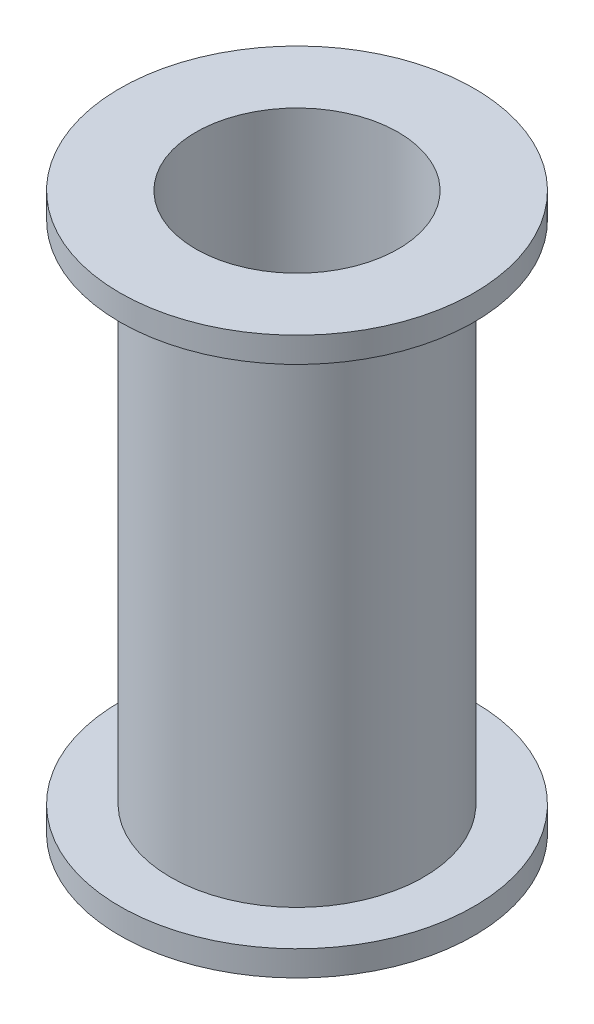
ISO-10303-21;
HEADER;
FILE_DESCRIPTION(('STEP AP214'),'2;1');
FILE_NAME('part.step','',(''),(''),'','','');
FILE_SCHEMA(('AUTOMOTIVE_DESIGN { 1 0 10303 214 1 1 1 1 }'));
ENDSEC;
DATA;
#1=APPLICATION_CONTEXT('core data for automotive mechanical design processes');
#2=APPLICATION_PROTOCOL_DEFINITION('international standard','automotive_design',2000,#1);
#3=PRODUCT_CONTEXT('',#1,'mechanical');
#4=PRODUCT('Part','Part','',(#3));
#5=PRODUCT_RELATED_PRODUCT_CATEGORY('part','',(#4));
#6=PRODUCT_DEFINITION_FORMATION('','',#4);
#7=PRODUCT_DEFINITION_CONTEXT('part definition',#1,'design');
#8=PRODUCT_DEFINITION('design','',#6,#7);
#9=PRODUCT_DEFINITION_SHAPE('','',#8);
#10=(LENGTH_UNIT() NAMED_UNIT(*) SI_UNIT(.MILLI.,.METRE.));
#11=(NAMED_UNIT(*) PLANE_ANGLE_UNIT() SI_UNIT($,.RADIAN.));
#12=(NAMED_UNIT(*) SI_UNIT($,.STERADIAN.) SOLID_ANGLE_UNIT());
#13=UNCERTAINTY_MEASURE_WITH_UNIT(LENGTH_MEASURE(1.E-05),#10,'distance_accuracy_value','');
#14=(GEOMETRIC_REPRESENTATION_CONTEXT(3) GLOBAL_UNCERTAINTY_ASSIGNED_CONTEXT((#13)) GLOBAL_UNIT_ASSIGNED_CONTEXT((#10,
#11,#12)) REPRESENTATION_CONTEXT('',''));
#15=CARTESIAN_POINT('',(0.,0.,0.));
#16=DIRECTION('',(0.,0.,1.));
#17=DIRECTION('',(1.,0.,0.));
#18=AXIS2_PLACEMENT_3D('',#15,#16,#17);
#19=CARTESIAN_POINT('',(0.,200.,0.));
#20=DIRECTION('',(0.,-1.,0.));
#21=DIRECTION('',(0.,0.,-1.));
#22=AXIS2_PLACEMENT_3D('',#19,#20,#21);
#23=CYLINDRICAL_SURFACE('',#22,50.);
#24=CARTESIAN_POINT('',(0.,200.,0.));
#25=DIRECTION('',(0.,1.,0.));
#26=DIRECTION('',(0.,0.,1.));
#27=AXIS2_PLACEMENT_3D('',#24,#25,#26);
#28=CIRCLE('',#27,50.);
#29=CARTESIAN_POINT('',(0.,200.,50.));
#30=VERTEX_POINT('',#29);
#31=EDGE_CURVE('E10',#30,#30,#28,.T.);
#32=ORIENTED_EDGE('',*,*,#31,.F.);
#33=EDGE_LOOP('',(#32));
#34=FACE_BOUND('',#33,.T.);
#35=CARTESIAN_POINT('',(0.,0.,0.));
#36=DIRECTION('',(0.,1.,0.));
#37=DIRECTION('',(0.,0.,1.));
#38=AXIS2_PLACEMENT_3D('',#35,#36,#37);
#39=CIRCLE('',#38,50.);
#40=CARTESIAN_POINT('',(0.,0.,50.));
#41=VERTEX_POINT('',#40);
#42=EDGE_CURVE('E40',#41,#41,#39,.T.);
#43=ORIENTED_EDGE('',*,*,#42,.T.);
#44=EDGE_LOOP('',(#43));
#45=FACE_BOUND('',#44,.T.);
#46=ADVANCED_FACE('F37',(#34,#45),#23,.T.);
#47=CARTESIAN_POINT('',(0.,210.,0.));
#48=DIRECTION('',(0.,-1.,0.));
#49=DIRECTION('',(0.,0.,-1.));
#50=AXIS2_PLACEMENT_3D('',#47,#48,#49);
#51=CYLINDRICAL_SURFACE('',#50,70.);
#52=CARTESIAN_POINT('',(0.,210.,0.));
#53=DIRECTION('',(0.,1.,0.));
#54=DIRECTION('',(0.,0.,1.));
#55=AXIS2_PLACEMENT_3D('',#52,#53,#54);
#56=CIRCLE('',#55,70.);
#57=CARTESIAN_POINT('',(0.,210.,70.));
#58=VERTEX_POINT('',#57);
#59=EDGE_CURVE('E45',#58,#58,#56,.T.);
#60=ORIENTED_EDGE('',*,*,#59,.F.);
#61=EDGE_LOOP('',(#60));
#62=FACE_BOUND('',#61,.T.);
#63=CARTESIAN_POINT('',(0.,200.,0.));
#64=DIRECTION('',(0.,1.,0.));
#65=DIRECTION('',(0.,0.,1.));
#66=AXIS2_PLACEMENT_3D('',#63,#64,#65);
#67=CIRCLE('',#66,70.);
#68=CARTESIAN_POINT('',(0.,200.,70.));
#69=VERTEX_POINT('',#68);
#70=EDGE_CURVE('E50',#69,#69,#67,.T.);
#71=ORIENTED_EDGE('',*,*,#70,.T.);
#72=EDGE_LOOP('',(#71));
#73=FACE_BOUND('',#72,.T.);
#74=ADVANCED_FACE('F103',(#62,#73),#51,.T.);
#75=CARTESIAN_POINT('',(0.,210.,0.));
#76=DIRECTION('',(0.,1.,0.));
#77=DIRECTION('',(0.,0.,1.));
#78=AXIS2_PLACEMENT_3D('',#75,#76,#77);
#79=PLANE('',#78);
#80=CARTESIAN_POINT('',(0.,210.,0.));
#81=DIRECTION('',(0.,-1.,0.));
#82=DIRECTION('',(0.,0.,-1.));
#83=AXIS2_PLACEMENT_3D('',#80,#81,#82);
#84=CIRCLE('',#83,40.);
#85=CARTESIAN_POINT('',(0.,210.,-40.));
#86=VERTEX_POINT('',#85);
#87=EDGE_CURVE('E61',#86,#86,#84,.T.);
#88=ORIENTED_EDGE('',*,*,#87,.T.);
#89=EDGE_LOOP('',(#88));
#90=FACE_BOUND('',#89,.T.);
#91=ORIENTED_EDGE('',*,*,#59,.T.);
#92=EDGE_LOOP('',(#91));
#93=FACE_BOUND('',#92,.T.);
#94=ADVANCED_FACE('F73',(#90,#93),#79,.T.);
#95=CARTESIAN_POINT('',(0.,200.,0.));
#96=DIRECTION('',(0.,1.,0.));
#97=DIRECTION('',(0.,0.,1.));
#98=AXIS2_PLACEMENT_3D('',#95,#96,#97);
#99=PLANE('',#98);
#100=ORIENTED_EDGE('',*,*,#31,.T.);
#101=EDGE_LOOP('',(#100));
#102=FACE_BOUND('',#101,.T.);
#103=ORIENTED_EDGE('',*,*,#70,.F.);
#104=EDGE_LOOP('',(#103));
#105=FACE_BOUND('',#104,.T.);
#106=ADVANCED_FACE('F92',(#102,#105),#99,.F.);
#107=CARTESIAN_POINT('',(0.,-10.,0.));
#108=DIRECTION('',(0.,1.,0.));
#109=DIRECTION('',(0.,0.,1.));
#110=AXIS2_PLACEMENT_3D('',#107,#108,#109);
#111=CYLINDRICAL_SURFACE('',#110,70.);
#112=CARTESIAN_POINT('',(0.,-10.,0.));
#113=DIRECTION('',(0.,-1.,0.));
#114=DIRECTION('',(0.,0.,-1.));
#115=AXIS2_PLACEMENT_3D('',#112,#113,#114);
#116=CIRCLE('',#115,70.);
#117=CARTESIAN_POINT('',(0.,-10.,-70.));
#118=VERTEX_POINT('',#117);
#119=EDGE_CURVE('E60',#118,#118,#116,.T.);
#120=ORIENTED_EDGE('',*,*,#119,.F.);
#121=EDGE_LOOP('',(#120));
#122=FACE_BOUND('',#121,.T.);
#123=CARTESIAN_POINT('',(0.,0.,0.));
#124=DIRECTION('',(0.,-1.,0.));
#125=DIRECTION('',(0.,0.,-1.));
#126=AXIS2_PLACEMENT_3D('',#123,#124,#125);
#127=CIRCLE('',#126,70.);
#128=CARTESIAN_POINT('',(0.,0.,-70.));
#129=VERTEX_POINT('',#128);
#130=EDGE_CURVE('E56',#129,#129,#127,.T.);
#131=ORIENTED_EDGE('',*,*,#130,.T.);
#132=EDGE_LOOP('',(#131));
#133=FACE_BOUND('',#132,.T.);
#134=ADVANCED_FACE('F86',(#122,#133),#111,.T.);
#135=CARTESIAN_POINT('',(0.,-10.,0.));
#136=DIRECTION('',(0.,-1.,0.));
#137=DIRECTION('',(0.,0.,-1.));
#138=AXIS2_PLACEMENT_3D('',#135,#136,#137);
#139=PLANE('',#138);
#140=CARTESIAN_POINT('',(0.,-10.,0.));
#141=DIRECTION('',(0.,-1.,0.));
#142=DIRECTION('',(0.,0.,-1.));
#143=AXIS2_PLACEMENT_3D('',#140,#141,#142);
#144=CIRCLE('',#143,40.);
#145=CARTESIAN_POINT('',(0.,-10.,-40.));
#146=VERTEX_POINT('',#145);
#147=EDGE_CURVE('E65',#146,#146,#144,.T.);
#148=ORIENTED_EDGE('',*,*,#147,.F.);
#149=EDGE_LOOP('',(#148));
#150=FACE_BOUND('',#149,.T.);
#151=ORIENTED_EDGE('',*,*,#119,.T.);
#152=EDGE_LOOP('',(#151));
#153=FACE_BOUND('',#152,.T.);
#154=ADVANCED_FACE('F83',(#150,#153),#139,.T.);
#155=CARTESIAN_POINT('',(0.,0.,0.));
#156=DIRECTION('',(0.,-1.,0.));
#157=DIRECTION('',(0.,0.,-1.));
#158=AXIS2_PLACEMENT_3D('',#155,#156,#157);
#159=PLANE('',#158);
#160=ORIENTED_EDGE('',*,*,#42,.F.);
#161=EDGE_LOOP('',(#160));
#162=FACE_BOUND('',#161,.T.);
#163=ORIENTED_EDGE('',*,*,#130,.F.);
#164=EDGE_LOOP('',(#163));
#165=FACE_BOUND('',#164,.T.);
#166=ADVANCED_FACE('F79',(#162,#165),#159,.F.);
#167=CARTESIAN_POINT('',(0.,210.,0.));
#168=DIRECTION('',(0.,-1.,0.));
#169=DIRECTION('',(0.,0.,-1.));
#170=AXIS2_PLACEMENT_3D('',#167,#168,#169);
#171=CYLINDRICAL_SURFACE('',#170,40.);
#172=ORIENTED_EDGE('',*,*,#87,.F.);
#173=EDGE_LOOP('',(#172));
#174=FACE_BOUND('',#173,.T.);
#175=ORIENTED_EDGE('',*,*,#147,.T.);
#176=EDGE_LOOP('',(#175));
#177=FACE_BOUND('',#176,.T.);
#178=ADVANCED_FACE('F76',(#174,#177),#171,.F.);
#179=CLOSED_SHELL('',(#46,#74,#94,#106,#134,#154,#166,#178));
#180=MANIFOLD_SOLID_BREP('B2',#179);
#181=ADVANCED_BREP_SHAPE_REPRESENTATION('',(#18,#180),#14);
#182=SHAPE_DEFINITION_REPRESENTATION(#9,#181);
ENDSEC;
END-ISO-10303-21;
